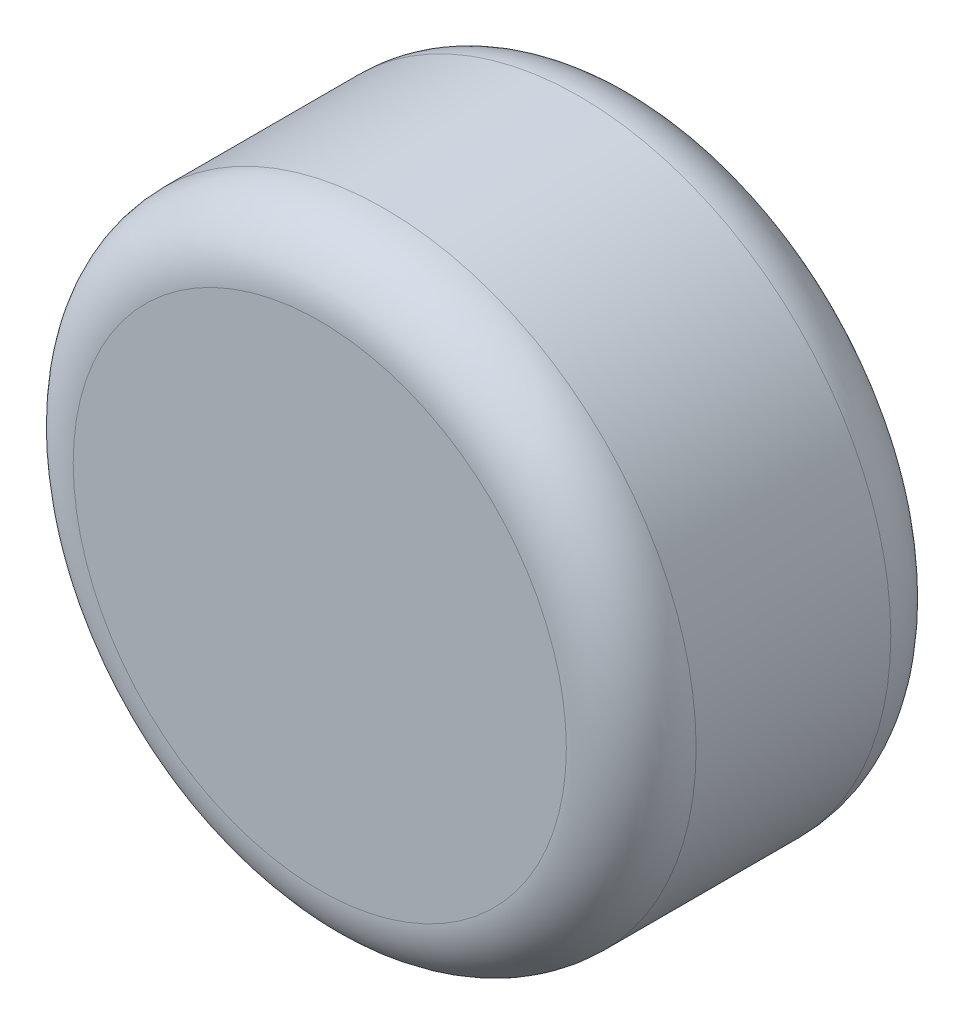
ISO-10303-21;
HEADER;
FILE_DESCRIPTION(('STEP AP214'),'2;1');
FILE_NAME('part.step','',(''),(''),'','','');
FILE_SCHEMA(('AUTOMOTIVE_DESIGN { 1 0 10303 214 1 1 1 1 }'));
ENDSEC;
DATA;
#1=APPLICATION_CONTEXT('core data for automotive mechanical design processes');
#2=APPLICATION_PROTOCOL_DEFINITION('international standard','automotive_design',2000,#1);
#3=PRODUCT_CONTEXT('',#1,'mechanical');
#4=PRODUCT('Part','Part','',(#3));
#5=PRODUCT_RELATED_PRODUCT_CATEGORY('part','',(#4));
#6=PRODUCT_DEFINITION_FORMATION('','',#4);
#7=PRODUCT_DEFINITION_CONTEXT('part definition',#1,'design');
#8=PRODUCT_DEFINITION('design','',#6,#7);
#9=PRODUCT_DEFINITION_SHAPE('','',#8);
#10=(LENGTH_UNIT() NAMED_UNIT(*) SI_UNIT(.MILLI.,.METRE.));
#11=(NAMED_UNIT(*) PLANE_ANGLE_UNIT() SI_UNIT($,.RADIAN.));
#12=(NAMED_UNIT(*) SI_UNIT($,.STERADIAN.) SOLID_ANGLE_UNIT());
#13=UNCERTAINTY_MEASURE_WITH_UNIT(LENGTH_MEASURE(1.E-05),#10,'distance_accuracy_value','');
#14=(GEOMETRIC_REPRESENTATION_CONTEXT(3) GLOBAL_UNCERTAINTY_ASSIGNED_CONTEXT((#13)) GLOBAL_UNIT_ASSIGNED_CONTEXT((#10,
#11,#12)) REPRESENTATION_CONTEXT('',''));
#15=CARTESIAN_POINT('',(0.,0.,0.));
#16=DIRECTION('',(0.,0.,1.));
#17=DIRECTION('',(1.,0.,0.));
#18=AXIS2_PLACEMENT_3D('',#15,#16,#17);
#19=CARTESIAN_POINT('',(0.,0.,25.));
#20=DIRECTION('',(0.,0.,-1.));
#21=DIRECTION('',(-1.,0.,0.));
#22=AXIS2_PLACEMENT_3D('',#19,#20,#21);
#23=CYLINDRICAL_SURFACE('',#22,24.);
#24=CARTESIAN_POINT('',(0.,0.,5.));
#25=DIRECTION('',(0.,0.,1.));
#26=DIRECTION('',(1.,0.,0.));
#27=AXIS2_PLACEMENT_3D('',#24,#25,#26);
#28=CIRCLE('',#27,24.);
#29=CARTESIAN_POINT('',(24.,0.,5.));
#30=VERTEX_POINT('',#29);
#31=EDGE_CURVE('E58',#30,#30,#28,.T.);
#32=ORIENTED_EDGE('',*,*,#31,.T.);
#33=EDGE_LOOP('',(#32));
#34=FACE_BOUND('',#33,.T.);
#35=CARTESIAN_POINT('',(0.,0.,20.));
#36=DIRECTION('',(0.,0.,1.));
#37=DIRECTION('',(1.,0.,0.));
#38=AXIS2_PLACEMENT_3D('',#35,#36,#37);
#39=CIRCLE('',#38,24.);
#40=CARTESIAN_POINT('',(24.,0.,20.));
#41=VERTEX_POINT('',#40);
#42=EDGE_CURVE('E62',#41,#41,#39,.F.);
#43=ORIENTED_EDGE('',*,*,#42,.T.);
#44=EDGE_LOOP('',(#43));
#45=FACE_BOUND('',#44,.T.);
#46=ADVANCED_FACE('F47',(#34,#45),#23,.T.);
#47=CARTESIAN_POINT('',(0.,0.,25.));
#48=DIRECTION('',(0.,0.,1.));
#49=DIRECTION('',(1.,0.,0.));
#50=AXIS2_PLACEMENT_3D('',#47,#48,#49);
#51=PLANE('',#50);
#52=CARTESIAN_POINT('',(0.,0.,25.));
#53=DIRECTION('',(0.,0.,1.));
#54=DIRECTION('',(1.,0.,0.));
#55=AXIS2_PLACEMENT_3D('',#52,#53,#54);
#56=CIRCLE('',#55,19.);
#57=CARTESIAN_POINT('',(19.,0.,25.));
#58=VERTEX_POINT('',#57);
#59=EDGE_CURVE('E11',#58,#58,#56,.T.);
#60=ORIENTED_EDGE('',*,*,#59,.T.);
#61=EDGE_LOOP('',(#60));
#62=FACE_BOUND('',#61,.T.);
#63=ADVANCED_FACE('F78',(#62),#51,.T.);
#64=CARTESIAN_POINT('',(0.,0.,0.));
#65=DIRECTION('',(0.,0.,1.));
#66=DIRECTION('',(1.,0.,0.));
#67=AXIS2_PLACEMENT_3D('',#64,#65,#66);
#68=PLANE('',#67);
#69=CARTESIAN_POINT('',(0.,0.,0.));
#70=DIRECTION('',(0.,0.,1.));
#71=DIRECTION('',(1.,0.,0.));
#72=AXIS2_PLACEMENT_3D('',#69,#70,#71);
#73=CIRCLE('',#72,19.);
#74=CARTESIAN_POINT('',(19.,0.,0.));
#75=VERTEX_POINT('',#74);
#76=EDGE_CURVE('E54',#75,#75,#73,.F.);
#77=ORIENTED_EDGE('',*,*,#76,.T.);
#78=EDGE_LOOP('',(#77));
#79=FACE_BOUND('',#78,.T.);
#80=ADVANCED_FACE('F75',(#79),#68,.F.);
#81=CARTESIAN_POINT('',(0.,0.,5.));
#82=DIRECTION('',(0.,0.,1.));
#83=DIRECTION('',(1.,0.,0.));
#84=AXIS2_PLACEMENT_3D('',#81,#82,#83);
#85=TOROIDAL_SURFACE('',#84,19.,5.);
#86=ORIENTED_EDGE('',*,*,#76,.F.);
#87=EDGE_LOOP('',(#86));
#88=FACE_BOUND('',#87,.T.);
#89=ORIENTED_EDGE('',*,*,#31,.F.);
#90=EDGE_LOOP('',(#89));
#91=FACE_BOUND('',#90,.T.);
#92=ADVANCED_FACE('F71',(#88,#91),#85,.T.);
#93=CARTESIAN_POINT('',(0.,0.,20.));
#94=DIRECTION('',(0.,0.,1.));
#95=DIRECTION('',(1.,0.,0.));
#96=AXIS2_PLACEMENT_3D('',#93,#94,#95);
#97=TOROIDAL_SURFACE('',#96,19.,5.);
#98=ORIENTED_EDGE('',*,*,#42,.F.);
#99=EDGE_LOOP('',(#98));
#100=FACE_BOUND('',#99,.T.);
#101=ORIENTED_EDGE('',*,*,#59,.F.);
#102=EDGE_LOOP('',(#101));
#103=FACE_BOUND('',#102,.T.);
#104=ADVANCED_FACE('F49',(#100,#103),#97,.T.);
#105=CLOSED_SHELL('',(#46,#63,#80,#92,#104));
#106=MANIFOLD_SOLID_BREP('B2',#105);
#107=ADVANCED_BREP_SHAPE_REPRESENTATION('',(#18,#106),#14);
#108=SHAPE_DEFINITION_REPRESENTATION(#9,#107);
ENDSEC;
END-ISO-10303-21;
